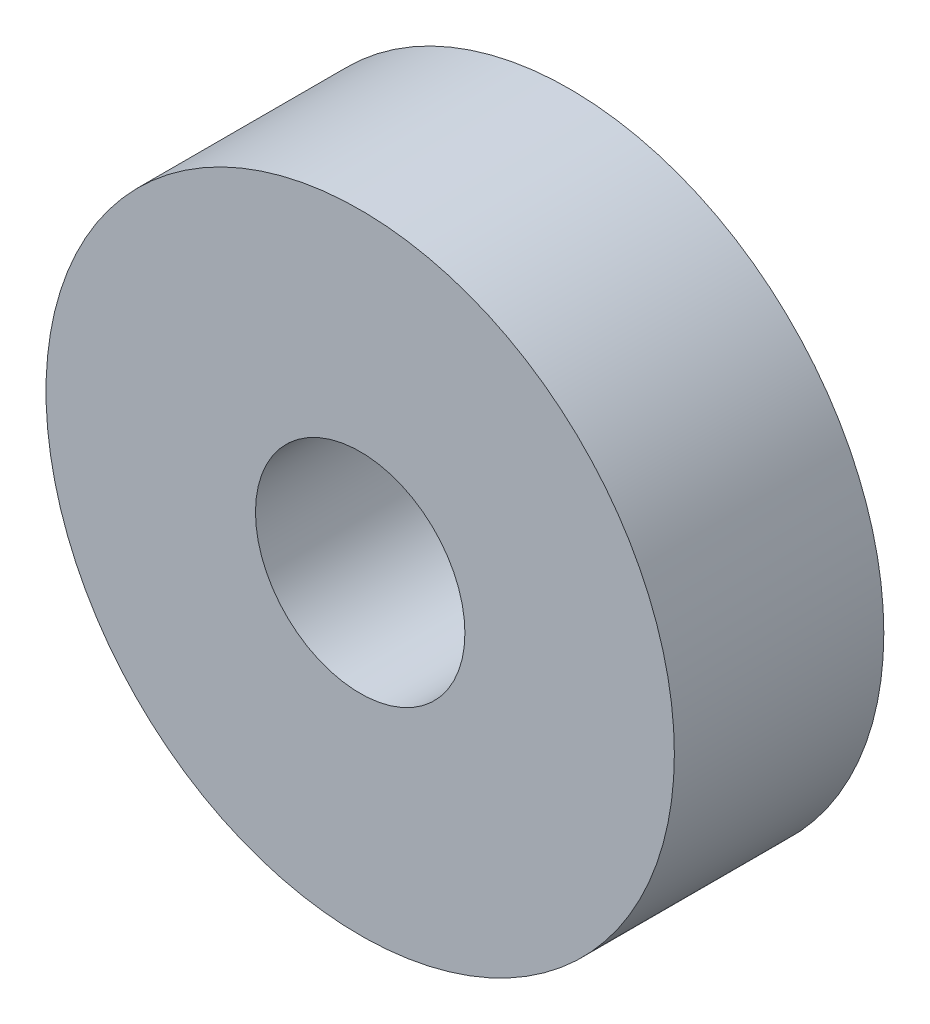
ISO-10303-21;
HEADER;
FILE_DESCRIPTION(('STEP AP214'),'2;1');
FILE_NAME('part.step','',(''),(''),'','','');
FILE_SCHEMA(('AUTOMOTIVE_DESIGN { 1 0 10303 214 1 1 1 1 }'));
ENDSEC;
DATA;
#1=APPLICATION_CONTEXT('core data for automotive mechanical design processes');
#2=APPLICATION_PROTOCOL_DEFINITION('international standard','automotive_design',2000,#1);
#3=PRODUCT_CONTEXT('',#1,'mechanical');
#4=PRODUCT('Part','Part','',(#3));
#5=PRODUCT_RELATED_PRODUCT_CATEGORY('part','',(#4));
#6=PRODUCT_DEFINITION_FORMATION('','',#4);
#7=PRODUCT_DEFINITION_CONTEXT('part definition',#1,'design');
#8=PRODUCT_DEFINITION('design','',#6,#7);
#9=PRODUCT_DEFINITION_SHAPE('','',#8);
#10=(LENGTH_UNIT() NAMED_UNIT(*) SI_UNIT(.MILLI.,.METRE.));
#11=(NAMED_UNIT(*) PLANE_ANGLE_UNIT() SI_UNIT($,.RADIAN.));
#12=(NAMED_UNIT(*) SI_UNIT($,.STERADIAN.) SOLID_ANGLE_UNIT());
#13=UNCERTAINTY_MEASURE_WITH_UNIT(LENGTH_MEASURE(1.E-05),#10,'distance_accuracy_value','');
#14=(GEOMETRIC_REPRESENTATION_CONTEXT(3) GLOBAL_UNCERTAINTY_ASSIGNED_CONTEXT((#13)) GLOBAL_UNIT_ASSIGNED_CONTEXT((#10,
#11,#12)) REPRESENTATION_CONTEXT('',''));
#15=CARTESIAN_POINT('',(0.,0.,0.));
#16=DIRECTION('',(0.,0.,1.));
#17=DIRECTION('',(1.,0.,0.));
#18=AXIS2_PLACEMENT_3D('',#15,#16,#17);
#19=CARTESIAN_POINT('',(0.,0.,1.));
#20=DIRECTION('',(0.,0.,1.));
#21=DIRECTION('',(1.,0.,0.));
#22=AXIS2_PLACEMENT_3D('',#19,#20,#21);
#23=PLANE('',#22);
#24=CARTESIAN_POINT('',(0.,0.,1.));
#25=DIRECTION('',(0.,0.,1.));
#26=DIRECTION('',(1.,0.,0.));
#27=AXIS2_PLACEMENT_3D('',#24,#25,#26);
#28=CIRCLE('',#27,1.5);
#29=CARTESIAN_POINT('',(1.5,0.,1.));
#30=VERTEX_POINT('',#29);
#31=EDGE_CURVE('E10',#30,#30,#28,.T.);
#32=ORIENTED_EDGE('',*,*,#31,.T.);
#33=EDGE_LOOP('',(#32));
#34=FACE_BOUND('',#33,.T.);
#35=CARTESIAN_POINT('',(0.,0.,1.));
#36=DIRECTION('',(0.,0.,1.));
#37=DIRECTION('',(1.,0.,0.));
#38=AXIS2_PLACEMENT_3D('',#35,#36,#37);
#39=CIRCLE('',#38,0.5);
#40=CARTESIAN_POINT('',(0.5,0.,1.));
#41=VERTEX_POINT('',#40);
#42=EDGE_CURVE('E50',#41,#41,#39,.T.);
#43=ORIENTED_EDGE('',*,*,#42,.F.);
#44=EDGE_LOOP('',(#43));
#45=FACE_BOUND('',#44,.T.);
#46=ADVANCED_FACE('F37',(#34,#45),#23,.T.);
#47=CARTESIAN_POINT('',(0.,0.,0.));
#48=DIRECTION('',(0.,0.,1.));
#49=DIRECTION('',(1.,0.,0.));
#50=AXIS2_PLACEMENT_3D('',#47,#48,#49);
#51=PLANE('',#50);
#52=CARTESIAN_POINT('',(0.,0.,0.));
#53=DIRECTION('',(0.,0.,1.));
#54=DIRECTION('',(1.,0.,0.));
#55=AXIS2_PLACEMENT_3D('',#52,#53,#54);
#56=CIRCLE('',#55,1.5);
#57=CARTESIAN_POINT('',(1.5,0.,0.));
#58=VERTEX_POINT('',#57);
#59=EDGE_CURVE('E41',#58,#58,#56,.T.);
#60=ORIENTED_EDGE('',*,*,#59,.F.);
#61=EDGE_LOOP('',(#60));
#62=FACE_BOUND('',#61,.T.);
#63=CARTESIAN_POINT('',(0.,0.,0.));
#64=DIRECTION('',(0.,0.,1.));
#65=DIRECTION('',(1.,0.,0.));
#66=AXIS2_PLACEMENT_3D('',#63,#64,#65);
#67=CIRCLE('',#66,0.5);
#68=CARTESIAN_POINT('',(0.5,0.,0.));
#69=VERTEX_POINT('',#68);
#70=EDGE_CURVE('E52',#69,#69,#67,.T.);
#71=ORIENTED_EDGE('',*,*,#70,.T.);
#72=EDGE_LOOP('',(#71));
#73=FACE_BOUND('',#72,.T.);
#74=ADVANCED_FACE('F64',(#62,#73),#51,.F.);
#75=CARTESIAN_POINT('',(0.,0.,1.));
#76=DIRECTION('',(0.,0.,-1.));
#77=DIRECTION('',(-1.,0.,0.));
#78=AXIS2_PLACEMENT_3D('',#75,#76,#77);
#79=CYLINDRICAL_SURFACE('',#78,1.5);
#80=ORIENTED_EDGE('',*,*,#31,.F.);
#81=EDGE_LOOP('',(#80));
#82=FACE_BOUND('',#81,.T.);
#83=ORIENTED_EDGE('',*,*,#59,.T.);
#84=EDGE_LOOP('',(#83));
#85=FACE_BOUND('',#84,.T.);
#86=ADVANCED_FACE('F39',(#82,#85),#79,.T.);
#87=CARTESIAN_POINT('',(0.,0.,1.));
#88=DIRECTION('',(0.,0.,-1.));
#89=DIRECTION('',(-1.,0.,0.));
#90=AXIS2_PLACEMENT_3D('',#87,#88,#89);
#91=CYLINDRICAL_SURFACE('',#90,0.5);
#92=ORIENTED_EDGE('',*,*,#42,.T.);
#93=EDGE_LOOP('',(#92));
#94=FACE_BOUND('',#93,.T.);
#95=ORIENTED_EDGE('',*,*,#70,.F.);
#96=EDGE_LOOP('',(#95));
#97=FACE_BOUND('',#96,.T.);
#98=ADVANCED_FACE('F60',(#94,#97),#91,.F.);
#99=CLOSED_SHELL('',(#46,#74,#86,#98));
#100=MANIFOLD_SOLID_BREP('B2',#99);
#101=ADVANCED_BREP_SHAPE_REPRESENTATION('',(#18,#100),#14);
#102=SHAPE_DEFINITION_REPRESENTATION(#9,#101);
ENDSEC;
END-ISO-10303-21;
